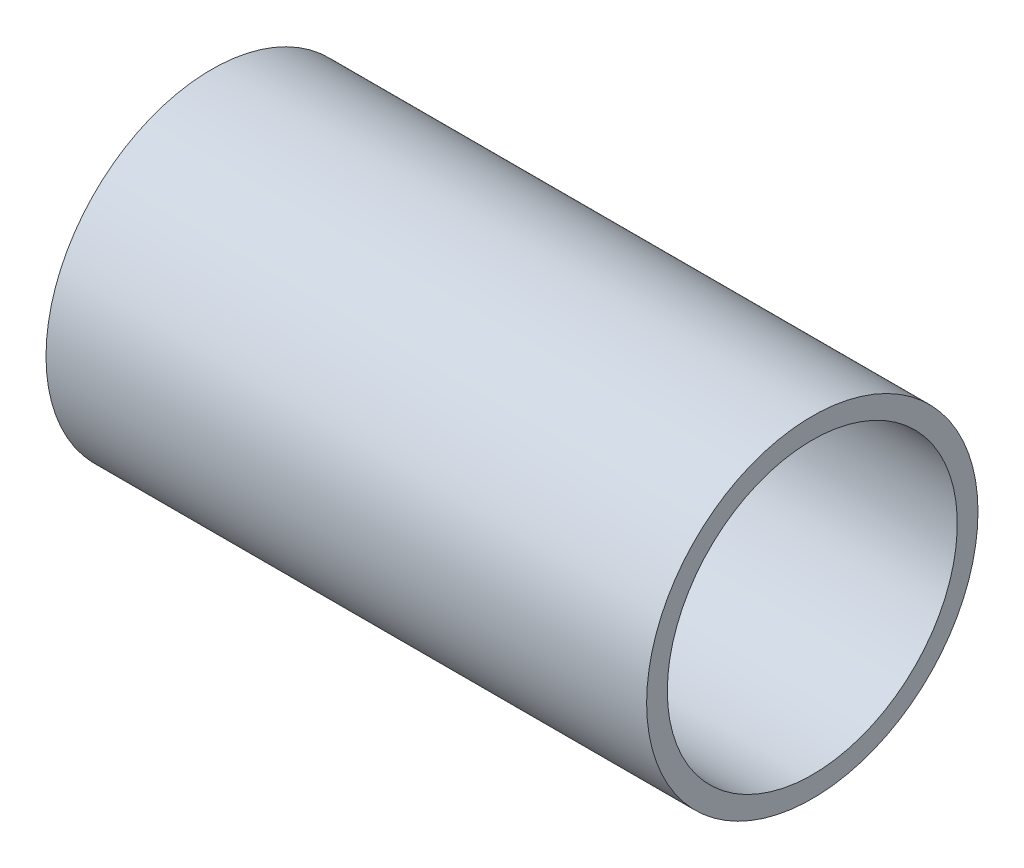
ISO-10303-21;
HEADER;
FILE_DESCRIPTION(('STEP AP214'),'2;1');
FILE_NAME('part.step','',(''),(''),'','','');
FILE_SCHEMA(('AUTOMOTIVE_DESIGN { 1 0 10303 214 1 1 1 1 }'));
ENDSEC;
DATA;
#1=APPLICATION_CONTEXT('core data for automotive mechanical design processes');
#2=APPLICATION_PROTOCOL_DEFINITION('international standard','automotive_design',2000,#1);
#3=PRODUCT_CONTEXT('',#1,'mechanical');
#4=PRODUCT('Part','Part','',(#3));
#5=PRODUCT_RELATED_PRODUCT_CATEGORY('part','',(#4));
#6=PRODUCT_DEFINITION_FORMATION('','',#4);
#7=PRODUCT_DEFINITION_CONTEXT('part definition',#1,'design');
#8=PRODUCT_DEFINITION('design','',#6,#7);
#9=PRODUCT_DEFINITION_SHAPE('','',#8);
#10=(LENGTH_UNIT() NAMED_UNIT(*) SI_UNIT(.MILLI.,.METRE.));
#11=(NAMED_UNIT(*) PLANE_ANGLE_UNIT() SI_UNIT($,.RADIAN.));
#12=(NAMED_UNIT(*) SI_UNIT($,.STERADIAN.) SOLID_ANGLE_UNIT());
#13=UNCERTAINTY_MEASURE_WITH_UNIT(LENGTH_MEASURE(1.E-05),#10,'distance_accuracy_value','');
#14=(GEOMETRIC_REPRESENTATION_CONTEXT(3) GLOBAL_UNCERTAINTY_ASSIGNED_CONTEXT((#13)) GLOBAL_UNIT_ASSIGNED_CONTEXT((#10,
#11,#12)) REPRESENTATION_CONTEXT('',''));
#15=CARTESIAN_POINT('',(0.,0.,0.));
#16=DIRECTION('',(0.,0.,1.));
#17=DIRECTION('',(1.,0.,0.));
#18=AXIS2_PLACEMENT_3D('',#15,#16,#17);
#19=CARTESIAN_POINT('',(-35.6168582375479,7.99999999999999,0.));
#20=DIRECTION('',(1.,0.,0.));
#21=DIRECTION('',(0.,0.,-1.));
#22=AXIS2_PLACEMENT_3D('',#19,#20,#21);
#23=PLANE('',#22);
#24=CARTESIAN_POINT('',(-35.6168582375479,0.,0.));
#25=DIRECTION('',(-1.,0.,0.));
#26=DIRECTION('',(0.,0.,1.));
#27=AXIS2_PLACEMENT_3D('',#24,#25,#26);
#28=CIRCLE('',#27,7.);
#29=CARTESIAN_POINT('',(-35.6168582375479,0.,7.));
#30=VERTEX_POINT('',#29);
#31=EDGE_CURVE('E10',#30,#30,#28,.T.);
#32=ORIENTED_EDGE('',*,*,#31,.F.);
#33=EDGE_LOOP('',(#32));
#34=FACE_BOUND('',#33,.T.);
#35=CARTESIAN_POINT('',(-35.6168582375479,0.,0.));
#36=DIRECTION('',(-1.,0.,0.));
#37=DIRECTION('',(0.,0.,1.));
#38=AXIS2_PLACEMENT_3D('',#35,#36,#37);
#39=CIRCLE('',#38,7.99999999999999);
#40=CARTESIAN_POINT('',(-35.6168582375479,0.,7.99999999999999));
#41=VERTEX_POINT('',#40);
#42=EDGE_CURVE('E53',#41,#41,#39,.T.);
#43=ORIENTED_EDGE('',*,*,#42,.T.);
#44=EDGE_LOOP('',(#43));
#45=FACE_BOUND('',#44,.T.);
#46=ADVANCED_FACE('F39',(#34,#45),#23,.F.);
#47=CARTESIAN_POINT('',(-36.7969348659004,0.,0.));
#48=DIRECTION('',(-1.,0.,0.));
#49=DIRECTION('',(0.,0.,1.));
#50=AXIS2_PLACEMENT_3D('',#47,#48,#49);
#51=CYLINDRICAL_SURFACE('',#50,7.);
#52=CARTESIAN_POINT('',(-6.6168582375479,0.,0.));
#53=DIRECTION('',(-1.,0.,0.));
#54=DIRECTION('',(0.,0.,1.));
#55=AXIS2_PLACEMENT_3D('',#52,#53,#54);
#56=CIRCLE('',#55,7.);
#57=CARTESIAN_POINT('',(-6.6168582375479,0.,7.));
#58=VERTEX_POINT('',#57);
#59=EDGE_CURVE('E45',#58,#58,#56,.T.);
#60=ORIENTED_EDGE('',*,*,#59,.F.);
#61=EDGE_LOOP('',(#60));
#62=FACE_BOUND('',#61,.T.);
#63=ORIENTED_EDGE('',*,*,#31,.T.);
#64=EDGE_LOOP('',(#63));
#65=FACE_BOUND('',#64,.T.);
#66=ADVANCED_FACE('F68',(#62,#65),#51,.F.);
#67=CARTESIAN_POINT('',(-6.6168582375479,7.,0.));
#68=DIRECTION('',(-1.,0.,0.));
#69=DIRECTION('',(0.,0.,1.));
#70=AXIS2_PLACEMENT_3D('',#67,#68,#69);
#71=PLANE('',#70);
#72=CARTESIAN_POINT('',(-6.6168582375479,0.,0.));
#73=DIRECTION('',(-1.,0.,0.));
#74=DIRECTION('',(0.,0.,1.));
#75=AXIS2_PLACEMENT_3D('',#72,#73,#74);
#76=CIRCLE('',#75,7.99999999999999);
#77=CARTESIAN_POINT('',(-6.6168582375479,0.,7.99999999999999));
#78=VERTEX_POINT('',#77);
#79=EDGE_CURVE('E49',#78,#78,#76,.T.);
#80=ORIENTED_EDGE('',*,*,#79,.F.);
#81=EDGE_LOOP('',(#80));
#82=FACE_BOUND('',#81,.T.);
#83=ORIENTED_EDGE('',*,*,#59,.T.);
#84=EDGE_LOOP('',(#83));
#85=FACE_BOUND('',#84,.T.);
#86=ADVANCED_FACE('F63',(#82,#85),#71,.F.);
#87=CARTESIAN_POINT('',(-36.7969348659004,0.,0.));
#88=DIRECTION('',(-1.,0.,0.));
#89=DIRECTION('',(0.,0.,1.));
#90=AXIS2_PLACEMENT_3D('',#87,#88,#89);
#91=CYLINDRICAL_SURFACE('',#90,7.99999999999999);
#92=ORIENTED_EDGE('',*,*,#42,.F.);
#93=EDGE_LOOP('',(#92));
#94=FACE_BOUND('',#93,.T.);
#95=ORIENTED_EDGE('',*,*,#79,.T.);
#96=EDGE_LOOP('',(#95));
#97=FACE_BOUND('',#96,.T.);
#98=ADVANCED_FACE('F60',(#94,#97),#91,.T.);
#99=CLOSED_SHELL('',(#46,#66,#86,#98));
#100=MANIFOLD_SOLID_BREP('B2',#99);
#101=ADVANCED_BREP_SHAPE_REPRESENTATION('',(#18,#100),#14);
#102=SHAPE_DEFINITION_REPRESENTATION(#9,#101);
ENDSEC;
END-ISO-10303-21;
